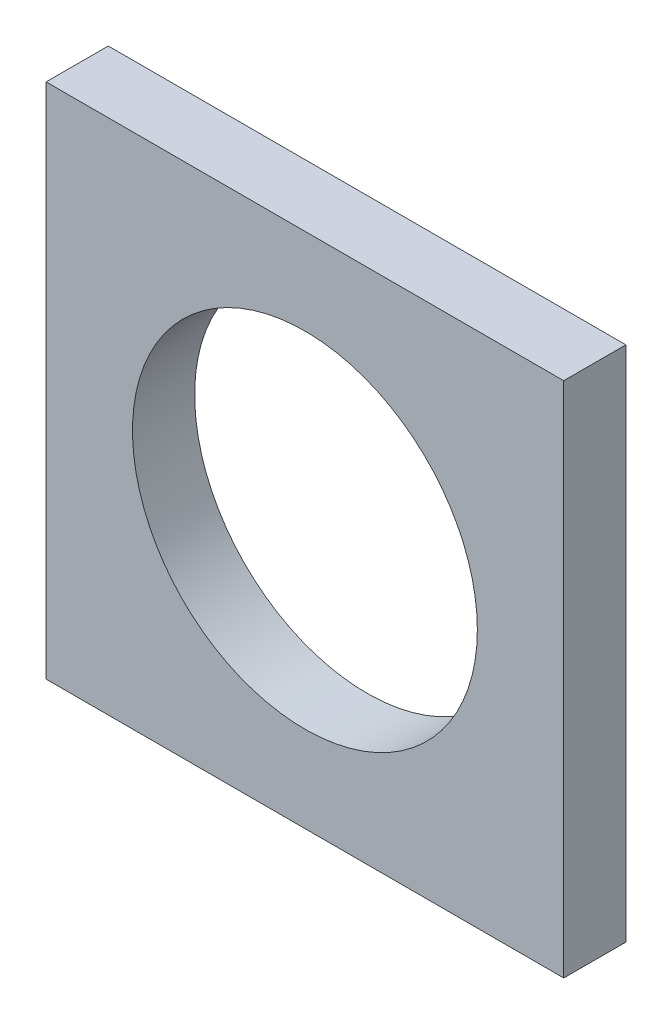
ISO-10303-21;
HEADER;
FILE_DESCRIPTION(('STEP AP214'),'2;1');
FILE_NAME('part.step','',(''),(''),'','','');
FILE_SCHEMA(('AUTOMOTIVE_DESIGN { 1 0 10303 214 1 1 1 1 }'));
ENDSEC;
DATA;
#1=APPLICATION_CONTEXT('core data for automotive mechanical design processes');
#2=APPLICATION_PROTOCOL_DEFINITION('international standard','automotive_design',2000,#1);
#3=PRODUCT_CONTEXT('',#1,'mechanical');
#4=PRODUCT('Part','Part','',(#3));
#5=PRODUCT_RELATED_PRODUCT_CATEGORY('part','',(#4));
#6=PRODUCT_DEFINITION_FORMATION('','',#4);
#7=PRODUCT_DEFINITION_CONTEXT('part definition',#1,'design');
#8=PRODUCT_DEFINITION('design','',#6,#7);
#9=PRODUCT_DEFINITION_SHAPE('','',#8);
#10=(LENGTH_UNIT() NAMED_UNIT(*) SI_UNIT(.MILLI.,.METRE.));
#11=(NAMED_UNIT(*) PLANE_ANGLE_UNIT() SI_UNIT($,.RADIAN.));
#12=(NAMED_UNIT(*) SI_UNIT($,.STERADIAN.) SOLID_ANGLE_UNIT());
#13=UNCERTAINTY_MEASURE_WITH_UNIT(LENGTH_MEASURE(1.E-05),#10,'distance_accuracy_value','');
#14=(GEOMETRIC_REPRESENTATION_CONTEXT(3) GLOBAL_UNCERTAINTY_ASSIGNED_CONTEXT((#13)) GLOBAL_UNIT_ASSIGNED_CONTEXT((#10,
#11,#12)) REPRESENTATION_CONTEXT('',''));
#15=CARTESIAN_POINT('',(0.,0.,0.));
#16=DIRECTION('',(0.,0.,1.));
#17=DIRECTION('',(1.,0.,0.));
#18=AXIS2_PLACEMENT_3D('',#15,#16,#17);
#19=CARTESIAN_POINT('',(134.563995361328,96.8420028686523,0.));
#20=DIRECTION('',(0.,-1.,0.));
#21=DIRECTION('',(-1.,0.,0.));
#22=AXIS2_PLACEMENT_3D('',#19,#20,#21);
#23=PLANE('',#22);
#24=DIRECTION('',(-1.,0.,0.));
#25=VECTOR('',#24,1.);
#26=CARTESIAN_POINT('',(134.563995361328,96.8420028686523,0.1999996));
#27=LINE('',#26,#25);
#28=CARTESIAN_POINT('',(134.563995361328,96.8420028686523,0.1999996));
#29=VERTEX_POINT('',#28);
#30=CARTESIAN_POINT('',(132.897994995117,96.8420028686523,0.1999996));
#31=VERTEX_POINT('',#30);
#32=EDGE_CURVE('E11',#29,#31,#27,.T.);
#33=ORIENTED_EDGE('',*,*,#32,.F.);
#34=DIRECTION('',(0.,0.,1.));
#35=VECTOR('',#34,1.);
#36=CARTESIAN_POINT('',(134.563995361328,96.8420028686523,0.));
#37=LINE('',#36,#35);
#38=CARTESIAN_POINT('',(134.563995361328,96.8420028686523,0.));
#39=VERTEX_POINT('',#38);
#40=EDGE_CURVE('E24',#39,#29,#37,.T.);
#41=ORIENTED_EDGE('',*,*,#40,.F.);
#42=DIRECTION('',(-1.,0.,0.));
#43=VECTOR('',#42,1.);
#44=CARTESIAN_POINT('',(134.563995361328,96.8420028686523,0.));
#45=LINE('',#44,#43);
#46=CARTESIAN_POINT('',(132.897994995117,96.8420028686523,0.));
#47=VERTEX_POINT('',#46);
#48=EDGE_CURVE('E96',#39,#47,#45,.T.);
#49=ORIENTED_EDGE('',*,*,#48,.T.);
#50=DIRECTION('',(0.,0.,1.));
#51=VECTOR('',#50,1.);
#52=CARTESIAN_POINT('',(132.897994995117,96.8420028686523,0.));
#53=LINE('',#52,#51);
#54=EDGE_CURVE('E37',#47,#31,#53,.T.);
#55=ORIENTED_EDGE('',*,*,#54,.T.);
#56=EDGE_LOOP('',(#33,#41,#49,#55));
#57=FACE_BOUND('',#56,.T.);
#58=ADVANCED_FACE('F17',(#57),#23,.F.);
#59=CARTESIAN_POINT('',(132.897994995117,96.8420028686523,0.));
#60=DIRECTION('',(1.,0.,0.));
#61=DIRECTION('',(0.,-1.,0.));
#62=AXIS2_PLACEMENT_3D('',#59,#60,#61);
#63=PLANE('',#62);
#64=DIRECTION('',(0.,-1.,0.));
#65=VECTOR('',#64,1.);
#66=CARTESIAN_POINT('',(132.897994995117,96.8420028686523,0.1999996));
#67=LINE('',#66,#65);
#68=CARTESIAN_POINT('',(132.897994995117,95.177001953125,0.1999996));
#69=VERTEX_POINT('',#68);
#70=EDGE_CURVE('E92',#31,#69,#67,.T.);
#71=ORIENTED_EDGE('',*,*,#70,.F.);
#72=ORIENTED_EDGE('',*,*,#54,.F.);
#73=DIRECTION('',(0.,-1.,0.));
#74=VECTOR('',#73,1.);
#75=CARTESIAN_POINT('',(132.897994995117,96.8420028686523,0.));
#76=LINE('',#75,#74);
#77=CARTESIAN_POINT('',(132.897994995117,95.177001953125,0.));
#78=VERTEX_POINT('',#77);
#79=EDGE_CURVE('E89',#47,#78,#76,.T.);
#80=ORIENTED_EDGE('',*,*,#79,.T.);
#81=DIRECTION('',(0.,0.,1.));
#82=VECTOR('',#81,1.);
#83=CARTESIAN_POINT('',(132.897994995117,95.177001953125,0.));
#84=LINE('',#83,#82);
#85=EDGE_CURVE('E87',#78,#69,#84,.T.);
#86=ORIENTED_EDGE('',*,*,#85,.T.);
#87=EDGE_LOOP('',(#71,#72,#80,#86));
#88=FACE_BOUND('',#87,.T.);
#89=ADVANCED_FACE('F104',(#88),#63,.F.);
#90=CARTESIAN_POINT('',(132.897994995117,95.177001953125,0.));
#91=DIRECTION('',(0.,1.,0.));
#92=DIRECTION('',(1.,0.,0.));
#93=AXIS2_PLACEMENT_3D('',#90,#91,#92);
#94=PLANE('',#93);
#95=DIRECTION('',(1.,0.,0.));
#96=VECTOR('',#95,1.);
#97=CARTESIAN_POINT('',(132.897994995117,95.177001953125,0.1999996));
#98=LINE('',#97,#96);
#99=CARTESIAN_POINT('',(134.563995361328,95.177001953125,0.1999996));
#100=VERTEX_POINT('',#99);
#101=EDGE_CURVE('E84',#69,#100,#98,.T.);
#102=ORIENTED_EDGE('',*,*,#101,.F.);
#103=ORIENTED_EDGE('',*,*,#85,.F.);
#104=DIRECTION('',(1.,0.,0.));
#105=VECTOR('',#104,1.);
#106=CARTESIAN_POINT('',(132.897994995117,95.177001953125,0.));
#107=LINE('',#106,#105);
#108=CARTESIAN_POINT('',(134.563995361328,95.177001953125,0.));
#109=VERTEX_POINT('',#108);
#110=EDGE_CURVE('E81',#78,#109,#107,.T.);
#111=ORIENTED_EDGE('',*,*,#110,.T.);
#112=DIRECTION('',(0.,0.,1.));
#113=VECTOR('',#112,1.);
#114=CARTESIAN_POINT('',(134.563995361328,95.177001953125,0.));
#115=LINE('',#114,#113);
#116=EDGE_CURVE('E79',#109,#100,#115,.T.);
#117=ORIENTED_EDGE('',*,*,#116,.T.);
#118=EDGE_LOOP('',(#102,#103,#111,#117));
#119=FACE_BOUND('',#118,.T.);
#120=ADVANCED_FACE('F110',(#119),#94,.F.);
#121=CARTESIAN_POINT('',(134.563995361328,95.177001953125,0.));
#122=DIRECTION('',(-1.,0.,0.));
#123=DIRECTION('',(0.,1.,0.));
#124=AXIS2_PLACEMENT_3D('',#121,#122,#123);
#125=PLANE('',#124);
#126=DIRECTION('',(0.,1.,0.));
#127=VECTOR('',#126,1.);
#128=CARTESIAN_POINT('',(134.563995361328,95.177001953125,0.1999996));
#129=LINE('',#128,#127);
#130=EDGE_CURVE('E76',#100,#29,#129,.T.);
#131=ORIENTED_EDGE('',*,*,#130,.F.);
#132=ORIENTED_EDGE('',*,*,#116,.F.);
#133=DIRECTION('',(0.,1.,0.));
#134=VECTOR('',#133,1.);
#135=CARTESIAN_POINT('',(134.563995361328,95.177001953125,0.));
#136=LINE('',#135,#134);
#137=EDGE_CURVE('E68',#109,#39,#136,.T.);
#138=ORIENTED_EDGE('',*,*,#137,.T.);
#139=ORIENTED_EDGE('',*,*,#40,.T.);
#140=EDGE_LOOP('',(#131,#132,#138,#139));
#141=FACE_BOUND('',#140,.T.);
#142=ADVANCED_FACE('F111',(#141),#125,.F.);
#143=CARTESIAN_POINT('',(133.731,96.0090028,0.));
#144=DIRECTION('',(0.,0.,-1.));
#145=DIRECTION('',(1.,0.,0.));
#146=AXIS2_PLACEMENT_3D('',#143,#144,#145);
#147=CYLINDRICAL_SURFACE('',#146,0.55500016);
#148=DIRECTION('',(0.,0.,1.));
#149=VECTOR('',#148,1.);
#150=CARTESIAN_POINT('',(134.28600016,96.0090028,0.));
#151=LINE('',#150,#149);
#152=CARTESIAN_POINT('',(134.28600016,96.0090028,0.));
#153=VERTEX_POINT('',#152);
#154=CARTESIAN_POINT('',(134.28600016,96.0090028,0.1999996));
#155=VERTEX_POINT('',#154);
#156=EDGE_CURVE('E62',#153,#155,#151,.T.);
#157=ORIENTED_EDGE('',*,*,#156,.T.);
#158=CARTESIAN_POINT('',(133.731,96.0090028,0.1999996));
#159=DIRECTION('',(0.,0.,1.));
#160=DIRECTION('',(1.,0.,0.));
#161=AXIS2_PLACEMENT_3D('',#158,#159,#160);
#162=CIRCLE('',#161,0.55500016);
#163=EDGE_CURVE('E67',#155,#155,#162,.T.);
#164=ORIENTED_EDGE('',*,*,#163,.T.);
#165=ORIENTED_EDGE('',*,*,#156,.F.);
#166=CARTESIAN_POINT('',(133.731,96.0090028,0.));
#167=DIRECTION('',(0.,0.,1.));
#168=DIRECTION('',(1.,0.,0.));
#169=AXIS2_PLACEMENT_3D('',#166,#167,#168);
#170=CIRCLE('',#169,0.55500016);
#171=EDGE_CURVE('E65',#153,#153,#170,.T.);
#172=ORIENTED_EDGE('',*,*,#171,.F.);
#173=EDGE_LOOP('',(#157,#164,#165,#172));
#174=FACE_BOUND('',#173,.T.);
#175=ADVANCED_FACE('F64',(#174),#147,.F.);
#176=CARTESIAN_POINT('',(134.563995361328,96.8420028686523,0.));
#177=DIRECTION('',(0.,0.,-1.));
#178=DIRECTION('',(-1.,0.,0.));
#179=AXIS2_PLACEMENT_3D('',#176,#177,#178);
#180=PLANE('',#179);
#181=ORIENTED_EDGE('',*,*,#137,.F.);
#182=ORIENTED_EDGE('',*,*,#110,.F.);
#183=ORIENTED_EDGE('',*,*,#79,.F.);
#184=ORIENTED_EDGE('',*,*,#48,.F.);
#185=EDGE_LOOP('',(#181,#182,#183,#184));
#186=FACE_BOUND('',#185,.T.);
#187=ORIENTED_EDGE('',*,*,#171,.T.);
#188=EDGE_LOOP('',(#187));
#189=FACE_BOUND('',#188,.T.);
#190=ADVANCED_FACE('F71',(#186,#189),#180,.T.);
#191=CARTESIAN_POINT('',(134.563995361328,96.8420028686523,0.1999996));
#192=DIRECTION('',(0.,0.,-1.));
#193=DIRECTION('',(-1.,0.,0.));
#194=AXIS2_PLACEMENT_3D('',#191,#192,#193);
#195=PLANE('',#194);
#196=ORIENTED_EDGE('',*,*,#32,.T.);
#197=ORIENTED_EDGE('',*,*,#70,.T.);
#198=ORIENTED_EDGE('',*,*,#101,.T.);
#199=ORIENTED_EDGE('',*,*,#130,.T.);
#200=EDGE_LOOP('',(#196,#197,#198,#199));
#201=FACE_BOUND('',#200,.T.);
#202=ORIENTED_EDGE('',*,*,#163,.F.);
#203=EDGE_LOOP('',(#202));
#204=FACE_BOUND('',#203,.T.);
#205=ADVANCED_FACE('F107',(#201,#204),#195,.F.);
#206=CLOSED_SHELL('',(#58,#89,#120,#142,#175,#190,#205));
#207=MANIFOLD_SOLID_BREP('B1',#206);
#208=ADVANCED_BREP_SHAPE_REPRESENTATION('',(#18,#207),#14);
#209=SHAPE_DEFINITION_REPRESENTATION(#9,#208);
ENDSEC;
END-ISO-10303-21;
